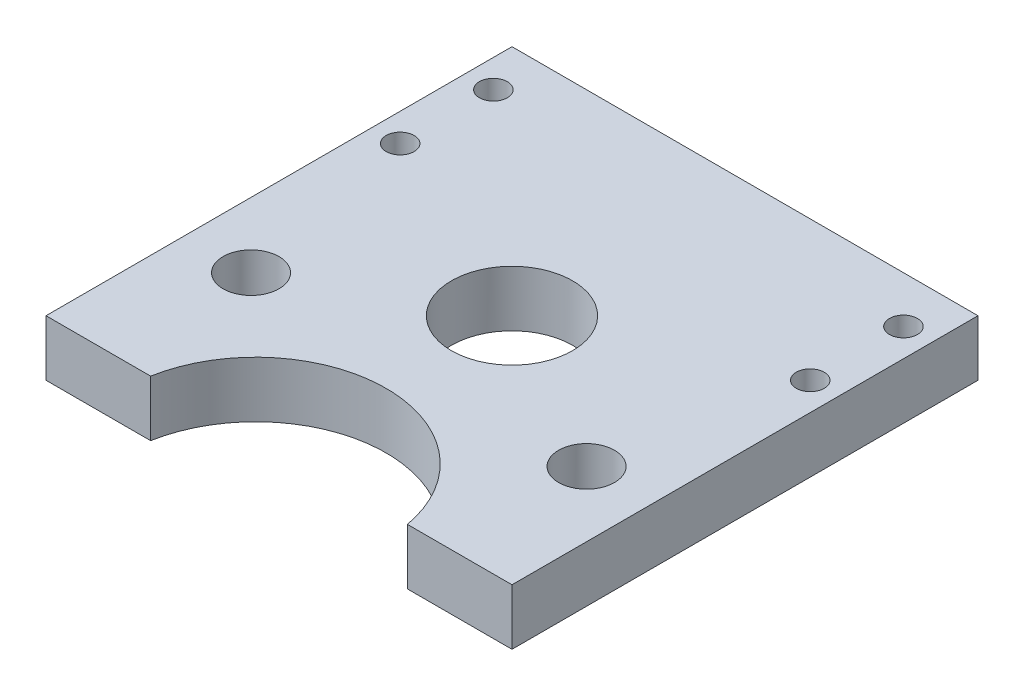
ISO-10303-21;
HEADER;
FILE_DESCRIPTION(('STEP AP214'),'2;1');
FILE_NAME('part.step','',(''),(''),'','','');
FILE_SCHEMA(('AUTOMOTIVE_DESIGN { 1 0 10303 214 1 1 1 1 }'));
ENDSEC;
DATA;
#1=APPLICATION_CONTEXT('core data for automotive mechanical design processes');
#2=APPLICATION_PROTOCOL_DEFINITION('international standard','automotive_design',2000,#1);
#3=PRODUCT_CONTEXT('',#1,'mechanical');
#4=PRODUCT('Part','Part','',(#3));
#5=PRODUCT_RELATED_PRODUCT_CATEGORY('part','',(#4));
#6=PRODUCT_DEFINITION_FORMATION('','',#4);
#7=PRODUCT_DEFINITION_CONTEXT('part definition',#1,'design');
#8=PRODUCT_DEFINITION('design','',#6,#7);
#9=PRODUCT_DEFINITION_SHAPE('','',#8);
#10=(LENGTH_UNIT() NAMED_UNIT(*) SI_UNIT(.MILLI.,.METRE.));
#11=(NAMED_UNIT(*) PLANE_ANGLE_UNIT() SI_UNIT($,.RADIAN.));
#12=(NAMED_UNIT(*) SI_UNIT($,.STERADIAN.) SOLID_ANGLE_UNIT());
#13=UNCERTAINTY_MEASURE_WITH_UNIT(LENGTH_MEASURE(1.E-05),#10,'distance_accuracy_value','');
#14=(GEOMETRIC_REPRESENTATION_CONTEXT(3) GLOBAL_UNCERTAINTY_ASSIGNED_CONTEXT((#13)) GLOBAL_UNIT_ASSIGNED_CONTEXT((#10,
#11,#12)) REPRESENTATION_CONTEXT('',''));
#15=CARTESIAN_POINT('',(0.,0.,0.));
#16=DIRECTION('',(0.,0.,1.));
#17=DIRECTION('',(1.,0.,0.));
#18=AXIS2_PLACEMENT_3D('',#15,#16,#17);
#19=CARTESIAN_POINT('',(-50.,12.,70.));
#20=DIRECTION('',(0.,0.,-1.));
#21=DIRECTION('',(-1.,0.,0.));
#22=AXIS2_PLACEMENT_3D('',#19,#20,#21);
#23=PLANE('',#22);
#24=DIRECTION('',(1.,0.,0.));
#25=VECTOR('',#24,1.);
#26=CARTESIAN_POINT('',(-50.,0.,70.));
#27=LINE('',#26,#25);
#28=CARTESIAN_POINT('',(-50.,0.,70.));
#29=VERTEX_POINT('',#28);
#30=CARTESIAN_POINT('',(-27.5499546279118,0.,70.));
#31=VERTEX_POINT('',#30);
#32=EDGE_CURVE('E104',#29,#31,#27,.T.);
#33=ORIENTED_EDGE('',*,*,#32,.T.);
#34=DIRECTION('',(0.,1.,0.));
#35=VECTOR('',#34,1.);
#36=CARTESIAN_POINT('',(-27.5499546279118,-0.000999999999999265,70.));
#37=LINE('',#36,#35);
#38=CARTESIAN_POINT('',(-27.5499546279118,12.,70.));
#39=VERTEX_POINT('',#38);
#40=EDGE_CURVE('E47',#39,#31,#37,.F.);
#41=ORIENTED_EDGE('',*,*,#40,.F.);
#42=DIRECTION('',(1.,0.,0.));
#43=VECTOR('',#42,1.);
#44=CARTESIAN_POINT('',(-50.,12.,70.));
#45=LINE('',#44,#43);
#46=CARTESIAN_POINT('',(-50.,12.,70.));
#47=VERTEX_POINT('',#46);
#48=EDGE_CURVE('E102',#47,#39,#45,.T.);
#49=ORIENTED_EDGE('',*,*,#48,.F.);
#50=DIRECTION('',(0.,-1.,0.));
#51=VECTOR('',#50,1.);
#52=CARTESIAN_POINT('',(-50.,12.,70.));
#53=LINE('',#52,#51);
#54=EDGE_CURVE('E112',#47,#29,#53,.T.);
#55=ORIENTED_EDGE('',*,*,#54,.T.);
#56=EDGE_LOOP('',(#33,#41,#49,#55));
#57=FACE_BOUND('',#56,.T.);
#58=ADVANCED_FACE('F32',(#57),#23,.F.);
#59=CARTESIAN_POINT('',(50.,12.,70.));
#60=DIRECTION('',(-1.,0.,0.));
#61=DIRECTION('',(0.,0.,1.));
#62=AXIS2_PLACEMENT_3D('',#59,#60,#61);
#63=PLANE('',#62);
#64=DIRECTION('',(0.,0.,-1.));
#65=VECTOR('',#64,1.);
#66=CARTESIAN_POINT('',(50.,0.,70.));
#67=LINE('',#66,#65);
#68=CARTESIAN_POINT('',(50.,0.,70.));
#69=VERTEX_POINT('',#68);
#70=CARTESIAN_POINT('',(50.,0.,-30.));
#71=VERTEX_POINT('',#70);
#72=EDGE_CURVE('E117',#69,#71,#67,.T.);
#73=ORIENTED_EDGE('',*,*,#72,.T.);
#74=DIRECTION('',(0.,-1.,0.));
#75=VECTOR('',#74,1.);
#76=CARTESIAN_POINT('',(50.,12.,-30.));
#77=LINE('',#76,#75);
#78=CARTESIAN_POINT('',(50.,12.,-30.));
#79=VERTEX_POINT('',#78);
#80=EDGE_CURVE('E11',#79,#71,#77,.T.);
#81=ORIENTED_EDGE('',*,*,#80,.F.);
#82=DIRECTION('',(0.,0.,-1.));
#83=VECTOR('',#82,1.);
#84=CARTESIAN_POINT('',(50.,12.,70.));
#85=LINE('',#84,#83);
#86=CARTESIAN_POINT('',(50.,12.,70.));
#87=VERTEX_POINT('',#86);
#88=EDGE_CURVE('E125',#87,#79,#85,.T.);
#89=ORIENTED_EDGE('',*,*,#88,.F.);
#90=DIRECTION('',(0.,-1.,0.));
#91=VECTOR('',#90,1.);
#92=CARTESIAN_POINT('',(50.,12.,70.));
#93=LINE('',#92,#91);
#94=EDGE_CURVE('E110',#87,#69,#93,.T.);
#95=ORIENTED_EDGE('',*,*,#94,.T.);
#96=EDGE_LOOP('',(#73,#81,#89,#95));
#97=FACE_BOUND('',#96,.T.);
#98=ADVANCED_FACE('F34',(#97),#63,.F.);
#99=CARTESIAN_POINT('',(-50.,12.,-30.));
#100=DIRECTION('',(0.,0.,1.));
#101=DIRECTION('',(1.,0.,0.));
#102=AXIS2_PLACEMENT_3D('',#99,#100,#101);
#103=PLANE('',#102);
#104=DIRECTION('',(-1.,0.,0.));
#105=VECTOR('',#104,1.);
#106=CARTESIAN_POINT('',(-50.,0.,-30.));
#107=LINE('',#106,#105);
#108=CARTESIAN_POINT('',(-50.,0.,-30.));
#109=VERTEX_POINT('',#108);
#110=EDGE_CURVE('E120',#71,#109,#107,.T.);
#111=ORIENTED_EDGE('',*,*,#110,.T.);
#112=DIRECTION('',(0.,-1.,0.));
#113=VECTOR('',#112,1.);
#114=CARTESIAN_POINT('',(-50.,12.,-30.));
#115=LINE('',#114,#113);
#116=CARTESIAN_POINT('',(-50.,12.,-30.));
#117=VERTEX_POINT('',#116);
#118=EDGE_CURVE('E40',#117,#109,#115,.T.);
#119=ORIENTED_EDGE('',*,*,#118,.F.);
#120=DIRECTION('',(-1.,0.,0.));
#121=VECTOR('',#120,1.);
#122=CARTESIAN_POINT('',(-50.,12.,-30.));
#123=LINE('',#122,#121);
#124=EDGE_CURVE('E85',#79,#117,#123,.T.);
#125=ORIENTED_EDGE('',*,*,#124,.F.);
#126=ORIENTED_EDGE('',*,*,#80,.T.);
#127=EDGE_LOOP('',(#111,#119,#125,#126));
#128=FACE_BOUND('',#127,.T.);
#129=ADVANCED_FACE('F181',(#128),#103,.F.);
#130=CARTESIAN_POINT('',(-50.,12.,-30.));
#131=DIRECTION('',(1.,0.,0.));
#132=DIRECTION('',(0.,0.,-1.));
#133=AXIS2_PLACEMENT_3D('',#130,#131,#132);
#134=PLANE('',#133);
#135=DIRECTION('',(0.,0.,1.));
#136=VECTOR('',#135,1.);
#137=CARTESIAN_POINT('',(-50.,0.,-30.));
#138=LINE('',#137,#136);
#139=EDGE_CURVE('E123',#109,#29,#138,.T.);
#140=ORIENTED_EDGE('',*,*,#139,.T.);
#141=ORIENTED_EDGE('',*,*,#54,.F.);
#142=DIRECTION('',(0.,0.,1.));
#143=VECTOR('',#142,1.);
#144=CARTESIAN_POINT('',(-50.,12.,-30.));
#145=LINE('',#144,#143);
#146=EDGE_CURVE('E108',#117,#47,#145,.T.);
#147=ORIENTED_EDGE('',*,*,#146,.F.);
#148=ORIENTED_EDGE('',*,*,#118,.T.);
#149=EDGE_LOOP('',(#140,#141,#147,#148));
#150=FACE_BOUND('',#149,.T.);
#151=ADVANCED_FACE('F130',(#150),#134,.F.);
#152=CARTESIAN_POINT('',(27.5499546279118,12.,70.));
#153=VERTEX_POINT('',#152);
#154=EDGE_CURVE('E56',#153,#87,#45,.T.);
#155=ORIENTED_EDGE('',*,*,#154,.F.);
#156=DIRECTION('',(0.,1.,0.));
#157=VECTOR('',#156,1.);
#158=CARTESIAN_POINT('',(27.5499546279118,-0.000999999999999265,70.));
#159=LINE('',#158,#157);
#160=CARTESIAN_POINT('',(27.5499546279118,0.,70.));
#161=VERTEX_POINT('',#160);
#162=EDGE_CURVE('E94',#161,#153,#159,.T.);
#163=ORIENTED_EDGE('',*,*,#162,.F.);
#164=EDGE_CURVE('E78',#161,#69,#27,.T.);
#165=ORIENTED_EDGE('',*,*,#164,.T.);
#166=ORIENTED_EDGE('',*,*,#94,.F.);
#167=EDGE_LOOP('',(#155,#163,#165,#166));
#168=FACE_BOUND('',#167,.T.);
#169=ADVANCED_FACE('F187',(#168),#23,.F.);
#170=CARTESIAN_POINT('',(50.,12.,-30.));
#171=DIRECTION('',(0.,-1.,0.));
#172=DIRECTION('',(0.,0.,-1.));
#173=AXIS2_PLACEMENT_3D('',#170,#171,#172);
#174=PLANE('',#173);
#175=CARTESIAN_POINT('',(36.,12.,40.));
#176=DIRECTION('',(0.,1.,0.));
#177=DIRECTION('',(0.,0.,1.));
#178=AXIS2_PLACEMENT_3D('',#175,#176,#177);
#179=CIRCLE('',#178,6.00000000000001);
#180=CARTESIAN_POINT('',(36.,12.,46.));
#181=VERTEX_POINT('',#180);
#182=EDGE_CURVE('E138',#181,#181,#179,.T.);
#183=ORIENTED_EDGE('',*,*,#182,.F.);
#184=EDGE_LOOP('',(#183));
#185=FACE_BOUND('',#184,.T.);
#186=CARTESIAN_POINT('',(-36.,12.,40.));
#187=DIRECTION('',(0.,1.,0.));
#188=DIRECTION('',(0.,0.,1.));
#189=AXIS2_PLACEMENT_3D('',#186,#187,#188);
#190=CIRCLE('',#189,6.);
#191=CARTESIAN_POINT('',(-36.,12.,46.));
#192=VERTEX_POINT('',#191);
#193=EDGE_CURVE('E144',#192,#192,#190,.T.);
#194=ORIENTED_EDGE('',*,*,#193,.F.);
#195=EDGE_LOOP('',(#194));
#196=FACE_BOUND('',#195,.T.);
#197=CARTESIAN_POINT('',(0.,12.,20.));
#198=DIRECTION('',(0.,1.,0.));
#199=DIRECTION('',(0.,0.,1.));
#200=AXIS2_PLACEMENT_3D('',#197,#198,#199);
#201=CIRCLE('',#200,13.);
#202=CARTESIAN_POINT('',(0.,12.,33.));
#203=VERTEX_POINT('',#202);
#204=EDGE_CURVE('E150',#203,#203,#201,.T.);
#205=ORIENTED_EDGE('',*,*,#204,.F.);
#206=EDGE_LOOP('',(#205));
#207=FACE_BOUND('',#206,.T.);
#208=CARTESIAN_POINT('',(44.,12.,0.));
#209=DIRECTION('',(0.,1.,0.));
#210=DIRECTION('',(0.,0.,1.));
#211=AXIS2_PLACEMENT_3D('',#208,#209,#210);
#212=CIRCLE('',#211,2.99999999999999);
#213=CARTESIAN_POINT('',(44.,12.,3.));
#214=VERTEX_POINT('',#213);
#215=EDGE_CURVE('E156',#214,#214,#212,.T.);
#216=ORIENTED_EDGE('',*,*,#215,.F.);
#217=EDGE_LOOP('',(#216));
#218=FACE_BOUND('',#217,.T.);
#219=CARTESIAN_POINT('',(44.,12.,-20.));
#220=DIRECTION('',(0.,1.,0.));
#221=DIRECTION('',(0.,0.,1.));
#222=AXIS2_PLACEMENT_3D('',#219,#220,#221);
#223=CIRCLE('',#222,3.);
#224=CARTESIAN_POINT('',(44.,12.,-17.));
#225=VERTEX_POINT('',#224);
#226=EDGE_CURVE('E162',#225,#225,#223,.T.);
#227=ORIENTED_EDGE('',*,*,#226,.F.);
#228=EDGE_LOOP('',(#227));
#229=FACE_BOUND('',#228,.T.);
#230=CARTESIAN_POINT('',(-44.,12.,0.));
#231=DIRECTION('',(0.,1.,0.));
#232=DIRECTION('',(0.,0.,1.));
#233=AXIS2_PLACEMENT_3D('',#230,#231,#232);
#234=CIRCLE('',#233,3.);
#235=CARTESIAN_POINT('',(-44.,12.,3.));
#236=VERTEX_POINT('',#235);
#237=EDGE_CURVE('E168',#236,#236,#234,.T.);
#238=ORIENTED_EDGE('',*,*,#237,.F.);
#239=EDGE_LOOP('',(#238));
#240=FACE_BOUND('',#239,.T.);
#241=CARTESIAN_POINT('',(-44.,12.,-20.));
#242=DIRECTION('',(0.,1.,0.));
#243=DIRECTION('',(0.,0.,1.));
#244=AXIS2_PLACEMENT_3D('',#241,#242,#243);
#245=CIRCLE('',#244,2.99999999999999);
#246=CARTESIAN_POINT('',(-44.,12.,-17.));
#247=VERTEX_POINT('',#246);
#248=EDGE_CURVE('E121',#247,#247,#245,.T.);
#249=ORIENTED_EDGE('',*,*,#248,.F.);
#250=EDGE_LOOP('',(#249));
#251=FACE_BOUND('',#250,.T.);
#252=ORIENTED_EDGE('',*,*,#48,.T.);
#253=CARTESIAN_POINT('',(0.,12.,75.));
#254=DIRECTION('',(0.,1.,0.));
#255=DIRECTION('',(0.,0.,1.));
#256=AXIS2_PLACEMENT_3D('',#253,#254,#255);
#257=CIRCLE('',#256,28.);
#258=EDGE_CURVE('E92',#153,#39,#257,.T.);
#259=ORIENTED_EDGE('',*,*,#258,.F.);
#260=ORIENTED_EDGE('',*,*,#154,.T.);
#261=ORIENTED_EDGE('',*,*,#88,.T.);
#262=ORIENTED_EDGE('',*,*,#124,.T.);
#263=ORIENTED_EDGE('',*,*,#146,.T.);
#264=EDGE_LOOP('',(#252,#259,#260,#261,#262,#263));
#265=FACE_BOUND('',#264,.T.);
#266=ADVANCED_FACE('F106',(#185,#196,#207,#218,#229,#240,#251,#265),#174,.F.);
#267=CARTESIAN_POINT('',(50.,0.,-30.));
#268=DIRECTION('',(0.,-1.,0.));
#269=DIRECTION('',(0.,0.,-1.));
#270=AXIS2_PLACEMENT_3D('',#267,#268,#269);
#271=PLANE('',#270);
#272=CARTESIAN_POINT('',(0.,0.,75.));
#273=DIRECTION('',(0.,-1.,0.));
#274=DIRECTION('',(0.,0.,-1.));
#275=AXIS2_PLACEMENT_3D('',#272,#273,#274);
#276=CIRCLE('',#275,28.);
#277=EDGE_CURVE('E96',#161,#31,#276,.F.);
#278=ORIENTED_EDGE('',*,*,#277,.T.);
#279=ORIENTED_EDGE('',*,*,#32,.F.);
#280=ORIENTED_EDGE('',*,*,#139,.F.);
#281=ORIENTED_EDGE('',*,*,#110,.F.);
#282=ORIENTED_EDGE('',*,*,#72,.F.);
#283=ORIENTED_EDGE('',*,*,#164,.F.);
#284=EDGE_LOOP('',(#278,#279,#280,#281,#282,#283));
#285=FACE_BOUND('',#284,.T.);
#286=CARTESIAN_POINT('',(36.,0.,40.));
#287=DIRECTION('',(0.,-1.,0.));
#288=DIRECTION('',(0.,0.,-1.));
#289=AXIS2_PLACEMENT_3D('',#286,#287,#288);
#290=CIRCLE('',#289,6.00000000000001);
#291=CARTESIAN_POINT('',(36.,0.,34.));
#292=VERTEX_POINT('',#291);
#293=EDGE_CURVE('E135',#292,#292,#290,.F.);
#294=ORIENTED_EDGE('',*,*,#293,.T.);
#295=EDGE_LOOP('',(#294));
#296=FACE_BOUND('',#295,.T.);
#297=CARTESIAN_POINT('',(-36.,0.,40.));
#298=DIRECTION('',(0.,-1.,0.));
#299=DIRECTION('',(0.,0.,-1.));
#300=AXIS2_PLACEMENT_3D('',#297,#298,#299);
#301=CIRCLE('',#300,6.);
#302=CARTESIAN_POINT('',(-36.,0.,34.));
#303=VERTEX_POINT('',#302);
#304=EDGE_CURVE('E142',#303,#303,#301,.F.);
#305=ORIENTED_EDGE('',*,*,#304,.T.);
#306=EDGE_LOOP('',(#305));
#307=FACE_BOUND('',#306,.T.);
#308=CARTESIAN_POINT('',(0.,0.,20.));
#309=DIRECTION('',(0.,-1.,0.));
#310=DIRECTION('',(0.,0.,-1.));
#311=AXIS2_PLACEMENT_3D('',#308,#309,#310);
#312=CIRCLE('',#311,13.);
#313=CARTESIAN_POINT('',(0.,0.,7.));
#314=VERTEX_POINT('',#313);
#315=EDGE_CURVE('E147',#314,#314,#312,.F.);
#316=ORIENTED_EDGE('',*,*,#315,.T.);
#317=EDGE_LOOP('',(#316));
#318=FACE_BOUND('',#317,.T.);
#319=CARTESIAN_POINT('',(44.,0.,0.));
#320=DIRECTION('',(0.,-1.,0.));
#321=DIRECTION('',(0.,0.,-1.));
#322=AXIS2_PLACEMENT_3D('',#319,#320,#321);
#323=CIRCLE('',#322,2.99999999999999);
#324=CARTESIAN_POINT('',(44.,0.,-2.99999999999999));
#325=VERTEX_POINT('',#324);
#326=EDGE_CURVE('E153',#325,#325,#323,.F.);
#327=ORIENTED_EDGE('',*,*,#326,.T.);
#328=EDGE_LOOP('',(#327));
#329=FACE_BOUND('',#328,.T.);
#330=CARTESIAN_POINT('',(44.,0.,-20.));
#331=DIRECTION('',(0.,-1.,0.));
#332=DIRECTION('',(0.,0.,-1.));
#333=AXIS2_PLACEMENT_3D('',#330,#331,#332);
#334=CIRCLE('',#333,3.);
#335=CARTESIAN_POINT('',(44.,0.,-23.));
#336=VERTEX_POINT('',#335);
#337=EDGE_CURVE('E159',#336,#336,#334,.F.);
#338=ORIENTED_EDGE('',*,*,#337,.T.);
#339=EDGE_LOOP('',(#338));
#340=FACE_BOUND('',#339,.T.);
#341=CARTESIAN_POINT('',(-44.,0.,0.));
#342=DIRECTION('',(0.,-1.,0.));
#343=DIRECTION('',(0.,0.,-1.));
#344=AXIS2_PLACEMENT_3D('',#341,#342,#343);
#345=CIRCLE('',#344,3.);
#346=CARTESIAN_POINT('',(-44.,0.,-3.));
#347=VERTEX_POINT('',#346);
#348=EDGE_CURVE('E165',#347,#347,#345,.F.);
#349=ORIENTED_EDGE('',*,*,#348,.T.);
#350=EDGE_LOOP('',(#349));
#351=FACE_BOUND('',#350,.T.);
#352=CARTESIAN_POINT('',(-44.,0.,-20.));
#353=DIRECTION('',(0.,-1.,0.));
#354=DIRECTION('',(0.,0.,-1.));
#355=AXIS2_PLACEMENT_3D('',#352,#353,#354);
#356=CIRCLE('',#355,2.99999999999999);
#357=CARTESIAN_POINT('',(-44.,0.,-23.));
#358=VERTEX_POINT('',#357);
#359=EDGE_CURVE('E171',#358,#358,#356,.F.);
#360=ORIENTED_EDGE('',*,*,#359,.T.);
#361=EDGE_LOOP('',(#360));
#362=FACE_BOUND('',#361,.T.);
#363=ADVANCED_FACE('F132',(#285,#296,#307,#318,#329,#340,#351,#362),#271,.T.);
#364=CARTESIAN_POINT('',(-44.,-0.000999999999999265,-20.));
#365=DIRECTION('',(0.,1.,0.));
#366=DIRECTION('',(0.,0.,1.));
#367=AXIS2_PLACEMENT_3D('',#364,#365,#366);
#368=CYLINDRICAL_SURFACE('',#367,2.99999999999999);
#369=ORIENTED_EDGE('',*,*,#359,.F.);
#370=EDGE_LOOP('',(#369));
#371=FACE_BOUND('',#370,.T.);
#372=ORIENTED_EDGE('',*,*,#248,.T.);
#373=EDGE_LOOP('',(#372));
#374=FACE_BOUND('',#373,.T.);
#375=ADVANCED_FACE('F204',(#371,#374),#368,.F.);
#376=CARTESIAN_POINT('',(-44.,-0.000999999999999265,0.));
#377=DIRECTION('',(0.,1.,0.));
#378=DIRECTION('',(0.,0.,1.));
#379=AXIS2_PLACEMENT_3D('',#376,#377,#378);
#380=CYLINDRICAL_SURFACE('',#379,3.);
#381=ORIENTED_EDGE('',*,*,#348,.F.);
#382=EDGE_LOOP('',(#381));
#383=FACE_BOUND('',#382,.T.);
#384=ORIENTED_EDGE('',*,*,#237,.T.);
#385=EDGE_LOOP('',(#384));
#386=FACE_BOUND('',#385,.T.);
#387=ADVANCED_FACE('F210',(#383,#386),#380,.F.);
#388=CARTESIAN_POINT('',(44.,-0.000999999999999265,-20.));
#389=DIRECTION('',(0.,1.,0.));
#390=DIRECTION('',(0.,0.,1.));
#391=AXIS2_PLACEMENT_3D('',#388,#389,#390);
#392=CYLINDRICAL_SURFACE('',#391,3.);
#393=ORIENTED_EDGE('',*,*,#337,.F.);
#394=EDGE_LOOP('',(#393));
#395=FACE_BOUND('',#394,.T.);
#396=ORIENTED_EDGE('',*,*,#226,.T.);
#397=EDGE_LOOP('',(#396));
#398=FACE_BOUND('',#397,.T.);
#399=ADVANCED_FACE('F214',(#395,#398),#392,.F.);
#400=CARTESIAN_POINT('',(44.,-0.000999999999999265,0.));
#401=DIRECTION('',(0.,1.,0.));
#402=DIRECTION('',(0.,0.,1.));
#403=AXIS2_PLACEMENT_3D('',#400,#401,#402);
#404=CYLINDRICAL_SURFACE('',#403,2.99999999999999);
#405=ORIENTED_EDGE('',*,*,#326,.F.);
#406=EDGE_LOOP('',(#405));
#407=FACE_BOUND('',#406,.T.);
#408=ORIENTED_EDGE('',*,*,#215,.T.);
#409=EDGE_LOOP('',(#408));
#410=FACE_BOUND('',#409,.T.);
#411=ADVANCED_FACE('F218',(#407,#410),#404,.F.);
#412=CARTESIAN_POINT('',(0.,-0.000999999999999265,20.));
#413=DIRECTION('',(0.,1.,0.));
#414=DIRECTION('',(0.,0.,1.));
#415=AXIS2_PLACEMENT_3D('',#412,#413,#414);
#416=CYLINDRICAL_SURFACE('',#415,13.);
#417=ORIENTED_EDGE('',*,*,#315,.F.);
#418=EDGE_LOOP('',(#417));
#419=FACE_BOUND('',#418,.T.);
#420=ORIENTED_EDGE('',*,*,#204,.T.);
#421=EDGE_LOOP('',(#420));
#422=FACE_BOUND('',#421,.T.);
#423=ADVANCED_FACE('F222',(#419,#422),#416,.F.);
#424=CARTESIAN_POINT('',(-36.,-0.000999999999999265,40.));
#425=DIRECTION('',(0.,1.,0.));
#426=DIRECTION('',(0.,0.,1.));
#427=AXIS2_PLACEMENT_3D('',#424,#425,#426);
#428=CYLINDRICAL_SURFACE('',#427,6.);
#429=ORIENTED_EDGE('',*,*,#304,.F.);
#430=EDGE_LOOP('',(#429));
#431=FACE_BOUND('',#430,.T.);
#432=ORIENTED_EDGE('',*,*,#193,.T.);
#433=EDGE_LOOP('',(#432));
#434=FACE_BOUND('',#433,.T.);
#435=ADVANCED_FACE('F226',(#431,#434),#428,.F.);
#436=CARTESIAN_POINT('',(36.,-0.000999999999999265,40.));
#437=DIRECTION('',(0.,1.,0.));
#438=DIRECTION('',(0.,0.,1.));
#439=AXIS2_PLACEMENT_3D('',#436,#437,#438);
#440=CYLINDRICAL_SURFACE('',#439,6.00000000000001);
#441=ORIENTED_EDGE('',*,*,#293,.F.);
#442=EDGE_LOOP('',(#441));
#443=FACE_BOUND('',#442,.T.);
#444=ORIENTED_EDGE('',*,*,#182,.T.);
#445=EDGE_LOOP('',(#444));
#446=FACE_BOUND('',#445,.T.);
#447=ADVANCED_FACE('F230',(#443,#446),#440,.F.);
#448=CARTESIAN_POINT('',(0.,-0.000999999999999265,75.));
#449=DIRECTION('',(0.,1.,0.));
#450=DIRECTION('',(0.,0.,1.));
#451=AXIS2_PLACEMENT_3D('',#448,#449,#450);
#452=CYLINDRICAL_SURFACE('',#451,28.);
#453=ORIENTED_EDGE('',*,*,#40,.T.);
#454=ORIENTED_EDGE('',*,*,#277,.F.);
#455=ORIENTED_EDGE('',*,*,#162,.T.);
#456=ORIENTED_EDGE('',*,*,#258,.T.);
#457=EDGE_LOOP('',(#453,#454,#455,#456));
#458=FACE_BOUND('',#457,.T.);
#459=ADVANCED_FACE('F93',(#458),#452,.F.);
#460=CLOSED_SHELL('',(#58,#98,#129,#151,#169,#266,#363,#375,#387,#399,#411,#423,#435,#447,#459));
#461=MANIFOLD_SOLID_BREP('B2',#460);
#462=ADVANCED_BREP_SHAPE_REPRESENTATION('',(#18,#461),#14);
#463=SHAPE_DEFINITION_REPRESENTATION(#9,#462);
ENDSEC;
END-ISO-10303-21;
